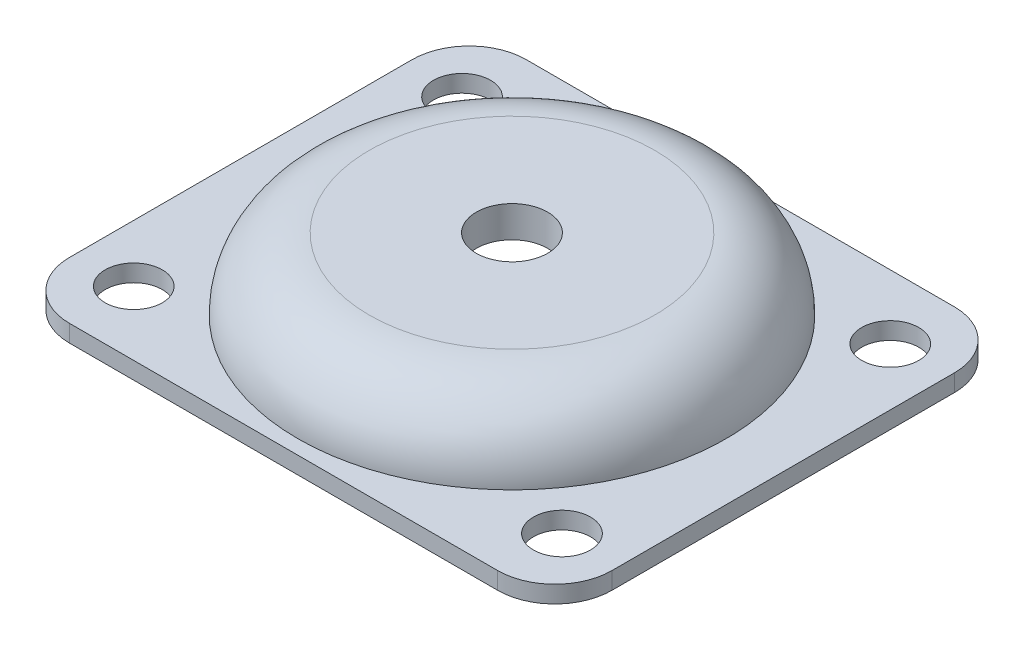
ISO-10303-21;
HEADER;
FILE_DESCRIPTION(('STEP AP214'),'2;1');
FILE_NAME('part.step','',(''),(''),'','','');
FILE_SCHEMA(('AUTOMOTIVE_DESIGN { 1 0 10303 214 1 1 1 1 }'));
ENDSEC;
DATA;
#1=APPLICATION_CONTEXT('core data for automotive mechanical design processes');
#2=APPLICATION_PROTOCOL_DEFINITION('international standard','automotive_design',2000,#1);
#3=PRODUCT_CONTEXT('',#1,'mechanical');
#4=PRODUCT('Part','Part','',(#3));
#5=PRODUCT_RELATED_PRODUCT_CATEGORY('part','',(#4));
#6=PRODUCT_DEFINITION_FORMATION('','',#4);
#7=PRODUCT_DEFINITION_CONTEXT('part definition',#1,'design');
#8=PRODUCT_DEFINITION('design','',#6,#7);
#9=PRODUCT_DEFINITION_SHAPE('','',#8);
#10=(LENGTH_UNIT() NAMED_UNIT(*) SI_UNIT(.MILLI.,.METRE.));
#11=(NAMED_UNIT(*) PLANE_ANGLE_UNIT() SI_UNIT($,.RADIAN.));
#12=(NAMED_UNIT(*) SI_UNIT($,.STERADIAN.) SOLID_ANGLE_UNIT());
#13=UNCERTAINTY_MEASURE_WITH_UNIT(LENGTH_MEASURE(1.E-05),#10,'distance_accuracy_value','');
#14=(GEOMETRIC_REPRESENTATION_CONTEXT(3) GLOBAL_UNCERTAINTY_ASSIGNED_CONTEXT((#13)) GLOBAL_UNIT_ASSIGNED_CONTEXT((#10,
#11,#12)) REPRESENTATION_CONTEXT('',''));
#15=CARTESIAN_POINT('',(0.,0.,0.));
#16=DIRECTION('',(0.,0.,1.));
#17=DIRECTION('',(1.,0.,0.));
#18=AXIS2_PLACEMENT_3D('',#15,#16,#17);
#19=CARTESIAN_POINT('',(19.,1.2,-16.));
#20=DIRECTION('',(-1.,0.,0.));
#21=DIRECTION('',(0.,0.,1.));
#22=AXIS2_PLACEMENT_3D('',#19,#20,#21);
#23=PLANE('',#22);
#24=DIRECTION('',(0.,0.,-1.));
#25=VECTOR('',#24,1.);
#26=CARTESIAN_POINT('',(19.,0.,-16.));
#27=LINE('',#26,#25);
#28=CARTESIAN_POINT('',(19.,0.,12.));
#29=VERTEX_POINT('',#28);
#30=CARTESIAN_POINT('',(19.,0.,-12.));
#31=VERTEX_POINT('',#30);
#32=EDGE_CURVE('E172',#29,#31,#27,.T.);
#33=ORIENTED_EDGE('',*,*,#32,.T.);
#34=DIRECTION('',(0.,-1.,0.));
#35=VECTOR('',#34,1.);
#36=CARTESIAN_POINT('',(19.,1.2,-12.));
#37=LINE('',#36,#35);
#38=CARTESIAN_POINT('',(19.,1.2,-12.));
#39=VERTEX_POINT('',#38);
#40=EDGE_CURVE('E11',#31,#39,#37,.F.);
#41=ORIENTED_EDGE('',*,*,#40,.T.);
#42=DIRECTION('',(0.,0.,-1.));
#43=VECTOR('',#42,1.);
#44=CARTESIAN_POINT('',(19.,1.2,-16.));
#45=LINE('',#44,#43);
#46=CARTESIAN_POINT('',(19.,1.2,12.));
#47=VERTEX_POINT('',#46);
#48=EDGE_CURVE('E128',#47,#39,#45,.T.);
#49=ORIENTED_EDGE('',*,*,#48,.F.);
#50=DIRECTION('',(0.,-1.,0.));
#51=VECTOR('',#50,1.);
#52=CARTESIAN_POINT('',(19.,1.2,12.));
#53=LINE('',#52,#51);
#54=EDGE_CURVE('E44',#47,#29,#53,.T.);
#55=ORIENTED_EDGE('',*,*,#54,.T.);
#56=EDGE_LOOP('',(#33,#41,#49,#55));
#57=FACE_BOUND('',#56,.T.);
#58=ADVANCED_FACE('F36',(#57),#23,.F.);
#59=CARTESIAN_POINT('',(-19.,1.2,-16.));
#60=DIRECTION('',(0.,0.,1.));
#61=DIRECTION('',(1.,0.,0.));
#62=AXIS2_PLACEMENT_3D('',#59,#60,#61);
#63=PLANE('',#62);
#64=DIRECTION('',(-1.,0.,0.));
#65=VECTOR('',#64,1.);
#66=CARTESIAN_POINT('',(-19.,0.,-16.));
#67=LINE('',#66,#65);
#68=CARTESIAN_POINT('',(15.,0.,-16.));
#69=VERTEX_POINT('',#68);
#70=CARTESIAN_POINT('',(-15.,0.,-16.));
#71=VERTEX_POINT('',#70);
#72=EDGE_CURVE('E133',#69,#71,#67,.T.);
#73=ORIENTED_EDGE('',*,*,#72,.T.);
#74=DIRECTION('',(0.,-1.,0.));
#75=VECTOR('',#74,1.);
#76=CARTESIAN_POINT('',(-15.,1.2,-16.));
#77=LINE('',#76,#75);
#78=CARTESIAN_POINT('',(-15.,1.2,-16.));
#79=VERTEX_POINT('',#78);
#80=EDGE_CURVE('E51',#71,#79,#77,.F.);
#81=ORIENTED_EDGE('',*,*,#80,.T.);
#82=DIRECTION('',(-1.,0.,0.));
#83=VECTOR('',#82,1.);
#84=CARTESIAN_POINT('',(-19.,1.2,-16.));
#85=LINE('',#84,#83);
#86=CARTESIAN_POINT('',(15.,1.2,-16.));
#87=VERTEX_POINT('',#86);
#88=EDGE_CURVE('E131',#87,#79,#85,.T.);
#89=ORIENTED_EDGE('',*,*,#88,.F.);
#90=DIRECTION('',(0.,-1.,0.));
#91=VECTOR('',#90,1.);
#92=CARTESIAN_POINT('',(15.,1.2,-16.));
#93=LINE('',#92,#91);
#94=EDGE_CURVE('E164',#87,#69,#93,.T.);
#95=ORIENTED_EDGE('',*,*,#94,.T.);
#96=EDGE_LOOP('',(#73,#81,#89,#95));
#97=FACE_BOUND('',#96,.T.);
#98=ADVANCED_FACE('F237',(#97),#63,.F.);
#99=CARTESIAN_POINT('',(-19.,1.2,-16.));
#100=DIRECTION('',(1.,0.,0.));
#101=DIRECTION('',(0.,0.,-1.));
#102=AXIS2_PLACEMENT_3D('',#99,#100,#101);
#103=PLANE('',#102);
#104=DIRECTION('',(0.,0.,1.));
#105=VECTOR('',#104,1.);
#106=CARTESIAN_POINT('',(-19.,0.,-16.));
#107=LINE('',#106,#105);
#108=CARTESIAN_POINT('',(-19.,0.,-12.));
#109=VERTEX_POINT('',#108);
#110=CARTESIAN_POINT('',(-19.,0.,12.));
#111=VERTEX_POINT('',#110);
#112=EDGE_CURVE('E129',#109,#111,#107,.T.);
#113=ORIENTED_EDGE('',*,*,#112,.T.);
#114=DIRECTION('',(0.,-1.,0.));
#115=VECTOR('',#114,1.);
#116=CARTESIAN_POINT('',(-19.,1.2,12.));
#117=LINE('',#116,#115);
#118=CARTESIAN_POINT('',(-19.,1.2,12.));
#119=VERTEX_POINT('',#118);
#120=EDGE_CURVE('E107',#111,#119,#117,.F.);
#121=ORIENTED_EDGE('',*,*,#120,.T.);
#122=DIRECTION('',(0.,0.,1.));
#123=VECTOR('',#122,1.);
#124=CARTESIAN_POINT('',(-19.,1.2,-16.));
#125=LINE('',#124,#123);
#126=CARTESIAN_POINT('',(-19.,1.2,-12.));
#127=VERTEX_POINT('',#126);
#128=EDGE_CURVE('E184',#127,#119,#125,.T.);
#129=ORIENTED_EDGE('',*,*,#128,.F.);
#130=DIRECTION('',(0.,-1.,0.));
#131=VECTOR('',#130,1.);
#132=CARTESIAN_POINT('',(-19.,1.2,-12.));
#133=LINE('',#132,#131);
#134=EDGE_CURVE('E112',#127,#109,#133,.T.);
#135=ORIENTED_EDGE('',*,*,#134,.T.);
#136=EDGE_LOOP('',(#113,#121,#129,#135));
#137=FACE_BOUND('',#136,.T.);
#138=ADVANCED_FACE('F241',(#137),#103,.F.);
#139=CARTESIAN_POINT('',(-19.,1.2,16.));
#140=DIRECTION('',(0.,0.,-1.));
#141=DIRECTION('',(-1.,0.,0.));
#142=AXIS2_PLACEMENT_3D('',#139,#140,#141);
#143=PLANE('',#142);
#144=DIRECTION('',(1.,0.,0.));
#145=VECTOR('',#144,1.);
#146=CARTESIAN_POINT('',(-19.,1.2,16.));
#147=LINE('',#146,#145);
#148=CARTESIAN_POINT('',(-15.,1.2,16.));
#149=VERTEX_POINT('',#148);
#150=CARTESIAN_POINT('',(15.,1.2,16.));
#151=VERTEX_POINT('',#150);
#152=EDGE_CURVE('E122',#149,#151,#147,.T.);
#153=ORIENTED_EDGE('',*,*,#152,.F.);
#154=DIRECTION('',(0.,-1.,0.));
#155=VECTOR('',#154,1.);
#156=CARTESIAN_POINT('',(-15.,1.2,16.));
#157=LINE('',#156,#155);
#158=CARTESIAN_POINT('',(-15.,0.,16.));
#159=VERTEX_POINT('',#158);
#160=EDGE_CURVE('E106',#149,#159,#157,.T.);
#161=ORIENTED_EDGE('',*,*,#160,.T.);
#162=DIRECTION('',(1.,0.,0.));
#163=VECTOR('',#162,1.);
#164=CARTESIAN_POINT('',(-19.,0.,16.));
#165=LINE('',#164,#163);
#166=CARTESIAN_POINT('',(15.,0.,16.));
#167=VERTEX_POINT('',#166);
#168=EDGE_CURVE('E119',#159,#167,#165,.T.);
#169=ORIENTED_EDGE('',*,*,#168,.T.);
#170=DIRECTION('',(0.,-1.,0.));
#171=VECTOR('',#170,1.);
#172=CARTESIAN_POINT('',(15.,1.2,16.));
#173=LINE('',#172,#171);
#174=EDGE_CURVE('E124',#167,#151,#173,.F.);
#175=ORIENTED_EDGE('',*,*,#174,.T.);
#176=EDGE_LOOP('',(#153,#161,#169,#175));
#177=FACE_BOUND('',#176,.T.);
#178=ADVANCED_FACE('F118',(#177),#143,.F.);
#179=CARTESIAN_POINT('',(0.,1.2,0.));
#180=DIRECTION('',(0.,1.,0.));
#181=DIRECTION('',(0.,0.,1.));
#182=AXIS2_PLACEMENT_3D('',#179,#180,#181);
#183=PLANE('',#182);
#184=CARTESIAN_POINT('',(-15.,1.2,11.5));
#185=DIRECTION('',(0.,1.,0.));
#186=DIRECTION('',(0.,0.,-1.));
#187=AXIS2_PLACEMENT_3D('',#184,#185,#186);
#188=CIRCLE('',#187,2.);
#189=CARTESIAN_POINT('',(-15.,1.2,9.5));
#190=VERTEX_POINT('',#189);
#191=EDGE_CURVE('E197',#190,#190,#188,.T.);
#192=ORIENTED_EDGE('',*,*,#191,.F.);
#193=EDGE_LOOP('',(#192));
#194=FACE_BOUND('',#193,.T.);
#195=CARTESIAN_POINT('',(15.,1.2,11.5));
#196=DIRECTION('',(0.,1.,0.));
#197=DIRECTION('',(0.,0.,-1.));
#198=AXIS2_PLACEMENT_3D('',#195,#196,#197);
#199=CIRCLE('',#198,2.);
#200=CARTESIAN_POINT('',(15.,1.2,9.5));
#201=VERTEX_POINT('',#200);
#202=EDGE_CURVE('E196',#201,#201,#199,.T.);
#203=ORIENTED_EDGE('',*,*,#202,.F.);
#204=EDGE_LOOP('',(#203));
#205=FACE_BOUND('',#204,.T.);
#206=CARTESIAN_POINT('',(15.,1.2,-11.5));
#207=DIRECTION('',(0.,1.,0.));
#208=DIRECTION('',(0.,0.,1.));
#209=AXIS2_PLACEMENT_3D('',#206,#207,#208);
#210=CIRCLE('',#209,2.);
#211=CARTESIAN_POINT('',(15.,1.2,-9.5));
#212=VERTEX_POINT('',#211);
#213=EDGE_CURVE('E203',#212,#212,#210,.T.);
#214=ORIENTED_EDGE('',*,*,#213,.F.);
#215=EDGE_LOOP('',(#214));
#216=FACE_BOUND('',#215,.T.);
#217=CARTESIAN_POINT('',(-15.,1.2,-11.5));
#218=DIRECTION('',(0.,1.,0.));
#219=DIRECTION('',(0.,0.,1.));
#220=AXIS2_PLACEMENT_3D('',#217,#218,#219);
#221=CIRCLE('',#220,2.);
#222=CARTESIAN_POINT('',(-15.,1.2,-9.5));
#223=VERTEX_POINT('',#222);
#224=EDGE_CURVE('E180',#223,#223,#221,.T.);
#225=ORIENTED_EDGE('',*,*,#224,.F.);
#226=EDGE_LOOP('',(#225));
#227=FACE_BOUND('',#226,.T.);
#228=CARTESIAN_POINT('',(0.,1.2,0.));
#229=DIRECTION('',(0.,1.,0.));
#230=DIRECTION('',(0.,0.,1.));
#231=AXIS2_PLACEMENT_3D('',#228,#229,#230);
#232=CIRCLE('',#231,15.);
#233=CARTESIAN_POINT('',(0.,1.2,15.));
#234=VERTEX_POINT('',#233);
#235=EDGE_CURVE('E141',#234,#234,#232,.T.);
#236=ORIENTED_EDGE('',*,*,#235,.F.);
#237=EDGE_LOOP('',(#236));
#238=FACE_BOUND('',#237,.T.);
#239=ORIENTED_EDGE('',*,*,#128,.T.);
#240=CARTESIAN_POINT('',(-15.,1.2,12.));
#241=DIRECTION('',(0.,1.,0.));
#242=DIRECTION('',(0.,0.,1.));
#243=AXIS2_PLACEMENT_3D('',#240,#241,#242);
#244=CIRCLE('',#243,4.);
#245=EDGE_CURVE('E162',#119,#149,#244,.T.);
#246=ORIENTED_EDGE('',*,*,#245,.T.);
#247=ORIENTED_EDGE('',*,*,#152,.T.);
#248=CARTESIAN_POINT('',(15.,1.2,12.));
#249=DIRECTION('',(0.,1.,0.));
#250=DIRECTION('',(0.,0.,1.));
#251=AXIS2_PLACEMENT_3D('',#248,#249,#250);
#252=CIRCLE('',#251,4.);
#253=EDGE_CURVE('E157',#151,#47,#252,.T.);
#254=ORIENTED_EDGE('',*,*,#253,.T.);
#255=ORIENTED_EDGE('',*,*,#48,.T.);
#256=CARTESIAN_POINT('',(15.,1.2,-12.));
#257=DIRECTION('',(0.,1.,0.));
#258=DIRECTION('',(0.,0.,1.));
#259=AXIS2_PLACEMENT_3D('',#256,#257,#258);
#260=CIRCLE('',#259,4.);
#261=EDGE_CURVE('E58',#39,#87,#260,.T.);
#262=ORIENTED_EDGE('',*,*,#261,.T.);
#263=ORIENTED_EDGE('',*,*,#88,.T.);
#264=CARTESIAN_POINT('',(-15.,1.2,-12.));
#265=DIRECTION('',(0.,1.,0.));
#266=DIRECTION('',(0.,0.,1.));
#267=AXIS2_PLACEMENT_3D('',#264,#265,#266);
#268=CIRCLE('',#267,4.);
#269=EDGE_CURVE('E160',#79,#127,#268,.T.);
#270=ORIENTED_EDGE('',*,*,#269,.T.);
#271=EDGE_LOOP('',(#239,#246,#247,#254,#255,#262,#263,#270));
#272=FACE_BOUND('',#271,.T.);
#273=ADVANCED_FACE('F249',(#194,#205,#216,#227,#238,#272),#183,.T.);
#274=CARTESIAN_POINT('',(0.,0.,0.));
#275=DIRECTION('',(0.,1.,0.));
#276=DIRECTION('',(0.,0.,1.));
#277=AXIS2_PLACEMENT_3D('',#274,#275,#276);
#278=PLANE('',#277);
#279=CARTESIAN_POINT('',(0.,0.,0.));
#280=DIRECTION('',(0.,-1.,0.));
#281=DIRECTION('',(0.,0.,-1.));
#282=AXIS2_PLACEMENT_3D('',#279,#280,#281);
#283=CIRCLE('',#282,14.);
#284=CARTESIAN_POINT('',(0.,0.,-14.));
#285=VERTEX_POINT('',#284);
#286=EDGE_CURVE('E147',#285,#285,#283,.T.);
#287=ORIENTED_EDGE('',*,*,#286,.F.);
#288=EDGE_LOOP('',(#287));
#289=FACE_BOUND('',#288,.T.);
#290=CARTESIAN_POINT('',(-15.,0.,11.5));
#291=DIRECTION('',(0.,1.,0.));
#292=DIRECTION('',(0.,0.,1.));
#293=AXIS2_PLACEMENT_3D('',#290,#291,#292);
#294=CIRCLE('',#293,2.);
#295=CARTESIAN_POINT('',(-15.,0.,13.5));
#296=VERTEX_POINT('',#295);
#297=EDGE_CURVE('E193',#296,#296,#294,.F.);
#298=ORIENTED_EDGE('',*,*,#297,.F.);
#299=EDGE_LOOP('',(#298));
#300=FACE_BOUND('',#299,.T.);
#301=CARTESIAN_POINT('',(15.,0.,11.5));
#302=DIRECTION('',(0.,1.,0.));
#303=DIRECTION('',(0.,0.,1.));
#304=AXIS2_PLACEMENT_3D('',#301,#302,#303);
#305=CIRCLE('',#304,2.);
#306=CARTESIAN_POINT('',(15.,0.,13.5));
#307=VERTEX_POINT('',#306);
#308=EDGE_CURVE('E200',#307,#307,#305,.F.);
#309=ORIENTED_EDGE('',*,*,#308,.F.);
#310=EDGE_LOOP('',(#309));
#311=FACE_BOUND('',#310,.T.);
#312=CARTESIAN_POINT('',(15.,0.,-11.5));
#313=DIRECTION('',(0.,1.,0.));
#314=DIRECTION('',(0.,0.,1.));
#315=AXIS2_PLACEMENT_3D('',#312,#313,#314);
#316=CIRCLE('',#315,2.);
#317=CARTESIAN_POINT('',(15.,0.,-9.5));
#318=VERTEX_POINT('',#317);
#319=EDGE_CURVE('E192',#318,#318,#316,.F.);
#320=ORIENTED_EDGE('',*,*,#319,.F.);
#321=EDGE_LOOP('',(#320));
#322=FACE_BOUND('',#321,.T.);
#323=CARTESIAN_POINT('',(-15.,0.,-11.5));
#324=DIRECTION('',(0.,1.,0.));
#325=DIRECTION('',(0.,0.,1.));
#326=AXIS2_PLACEMENT_3D('',#323,#324,#325);
#327=CIRCLE('',#326,2.);
#328=CARTESIAN_POINT('',(-15.,0.,-9.5));
#329=VERTEX_POINT('',#328);
#330=EDGE_CURVE('E177',#329,#329,#327,.F.);
#331=ORIENTED_EDGE('',*,*,#330,.F.);
#332=EDGE_LOOP('',(#331));
#333=FACE_BOUND('',#332,.T.);
#334=ORIENTED_EDGE('',*,*,#168,.F.);
#335=CARTESIAN_POINT('',(-15.,0.,12.));
#336=DIRECTION('',(0.,1.,0.));
#337=DIRECTION('',(0.,0.,1.));
#338=AXIS2_PLACEMENT_3D('',#335,#336,#337);
#339=CIRCLE('',#338,4.);
#340=EDGE_CURVE('E102',#159,#111,#339,.F.);
#341=ORIENTED_EDGE('',*,*,#340,.T.);
#342=ORIENTED_EDGE('',*,*,#112,.F.);
#343=CARTESIAN_POINT('',(-15.,0.,-12.));
#344=DIRECTION('',(0.,1.,0.));
#345=DIRECTION('',(0.,0.,1.));
#346=AXIS2_PLACEMENT_3D('',#343,#344,#345);
#347=CIRCLE('',#346,4.);
#348=EDGE_CURVE('E113',#109,#71,#347,.F.);
#349=ORIENTED_EDGE('',*,*,#348,.T.);
#350=ORIENTED_EDGE('',*,*,#72,.F.);
#351=CARTESIAN_POINT('',(15.,0.,-12.));
#352=DIRECTION('',(0.,1.,0.));
#353=DIRECTION('',(0.,0.,1.));
#354=AXIS2_PLACEMENT_3D('',#351,#352,#353);
#355=CIRCLE('',#354,4.);
#356=EDGE_CURVE('E151',#69,#31,#355,.F.);
#357=ORIENTED_EDGE('',*,*,#356,.T.);
#358=ORIENTED_EDGE('',*,*,#32,.F.);
#359=CARTESIAN_POINT('',(15.,0.,12.));
#360=DIRECTION('',(0.,1.,0.));
#361=DIRECTION('',(0.,0.,1.));
#362=AXIS2_PLACEMENT_3D('',#359,#360,#361);
#363=CIRCLE('',#362,4.);
#364=EDGE_CURVE('E123',#29,#167,#363,.F.);
#365=ORIENTED_EDGE('',*,*,#364,.T.);
#366=EDGE_LOOP('',(#334,#341,#342,#349,#350,#357,#358,#365));
#367=FACE_BOUND('',#366,.T.);
#368=ADVANCED_FACE('F126',(#289,#300,#311,#322,#333,#367),#278,.F.);
#369=CARTESIAN_POINT('',(0.,6.2,0.));
#370=DIRECTION('',(0.,1.,0.));
#371=DIRECTION('',(0.,0.,1.));
#372=AXIS2_PLACEMENT_3D('',#369,#370,#371);
#373=PLANE('',#372);
#374=CARTESIAN_POINT('',(0.,6.2,0.));
#375=DIRECTION('',(0.,1.,0.));
#376=DIRECTION('',(0.,0.,1.));
#377=AXIS2_PLACEMENT_3D('',#374,#375,#376);
#378=CIRCLE('',#377,2.5);
#379=CARTESIAN_POINT('',(0.,6.2,2.5));
#380=VERTEX_POINT('',#379);
#381=EDGE_CURVE('E148',#380,#380,#378,.T.);
#382=ORIENTED_EDGE('',*,*,#381,.F.);
#383=EDGE_LOOP('',(#382));
#384=FACE_BOUND('',#383,.T.);
#385=CARTESIAN_POINT('',(0.,6.2,0.));
#386=DIRECTION('',(0.,1.,0.));
#387=DIRECTION('',(0.,0.,1.));
#388=AXIS2_PLACEMENT_3D('',#385,#386,#387);
#389=CIRCLE('',#388,10.);
#390=CARTESIAN_POINT('',(0.,6.2,10.));
#391=VERTEX_POINT('',#390);
#392=EDGE_CURVE('E137',#391,#391,#389,.T.);
#393=ORIENTED_EDGE('',*,*,#392,.T.);
#394=EDGE_LOOP('',(#393));
#395=FACE_BOUND('',#394,.T.);
#396=ADVANCED_FACE('F217',(#384,#395),#373,.T.);
#397=CARTESIAN_POINT('',(0.,1.2,0.));
#398=DIRECTION('',(0.,1.,0.));
#399=DIRECTION('',(0.,0.,1.));
#400=AXIS2_PLACEMENT_3D('',#397,#398,#399);
#401=TOROIDAL_SURFACE('',#400,10.,5.);
#402=ORIENTED_EDGE('',*,*,#235,.T.);
#403=EDGE_LOOP('',(#402));
#404=FACE_BOUND('',#403,.T.);
#405=ORIENTED_EDGE('',*,*,#392,.F.);
#406=EDGE_LOOP('',(#405));
#407=FACE_BOUND('',#406,.T.);
#408=ADVANCED_FACE('F220',(#404,#407),#401,.T.);
#409=CARTESIAN_POINT('',(-15.,-0.000999999999999916,-11.5));
#410=DIRECTION('',(0.,1.,0.));
#411=DIRECTION('',(0.,0.,1.));
#412=AXIS2_PLACEMENT_3D('',#409,#410,#411);
#413=CYLINDRICAL_SURFACE('',#412,2.);
#414=ORIENTED_EDGE('',*,*,#224,.T.);
#415=EDGE_LOOP('',(#414));
#416=FACE_BOUND('',#415,.T.);
#417=ORIENTED_EDGE('',*,*,#330,.T.);
#418=EDGE_LOOP('',(#417));
#419=FACE_BOUND('',#418,.T.);
#420=ADVANCED_FACE('F225',(#416,#419),#413,.F.);
#421=CARTESIAN_POINT('',(15.,-0.000999999999999916,-11.5));
#422=DIRECTION('',(0.,1.,0.));
#423=DIRECTION('',(0.,0.,1.));
#424=AXIS2_PLACEMENT_3D('',#421,#422,#423);
#425=CYLINDRICAL_SURFACE('',#424,2.);
#426=ORIENTED_EDGE('',*,*,#213,.T.);
#427=EDGE_LOOP('',(#426));
#428=FACE_BOUND('',#427,.T.);
#429=ORIENTED_EDGE('',*,*,#319,.T.);
#430=EDGE_LOOP('',(#429));
#431=FACE_BOUND('',#430,.T.);
#432=ADVANCED_FACE('F231',(#428,#431),#425,.F.);
#433=CARTESIAN_POINT('',(15.,-0.000999999999999916,11.5));
#434=DIRECTION('',(0.,1.,0.));
#435=DIRECTION('',(0.,0.,1.));
#436=AXIS2_PLACEMENT_3D('',#433,#434,#435);
#437=CYLINDRICAL_SURFACE('',#436,2.);
#438=ORIENTED_EDGE('',*,*,#202,.T.);
#439=EDGE_LOOP('',(#438));
#440=FACE_BOUND('',#439,.T.);
#441=ORIENTED_EDGE('',*,*,#308,.T.);
#442=EDGE_LOOP('',(#441));
#443=FACE_BOUND('',#442,.T.);
#444=ADVANCED_FACE('F260',(#440,#443),#437,.F.);
#445=CARTESIAN_POINT('',(-15.,-0.000999999999999916,11.5));
#446=DIRECTION('',(0.,1.,0.));
#447=DIRECTION('',(0.,0.,1.));
#448=AXIS2_PLACEMENT_3D('',#445,#446,#447);
#449=CYLINDRICAL_SURFACE('',#448,2.);
#450=ORIENTED_EDGE('',*,*,#191,.T.);
#451=EDGE_LOOP('',(#450));
#452=FACE_BOUND('',#451,.T.);
#453=ORIENTED_EDGE('',*,*,#297,.T.);
#454=EDGE_LOOP('',(#453));
#455=FACE_BOUND('',#454,.T.);
#456=ADVANCED_FACE('F256',(#452,#455),#449,.F.);
#457=CARTESIAN_POINT('',(0.,4.,0.));
#458=DIRECTION('',(0.,-1.,0.));
#459=DIRECTION('',(0.,0.,-1.));
#460=AXIS2_PLACEMENT_3D('',#457,#458,#459);
#461=PLANE('',#460);
#462=CARTESIAN_POINT('',(0.,4.,0.));
#463=DIRECTION('',(0.,-1.,0.));
#464=DIRECTION('',(0.,0.,-1.));
#465=AXIS2_PLACEMENT_3D('',#462,#463,#464);
#466=CIRCLE('',#465,2.5);
#467=CARTESIAN_POINT('',(0.,4.,2.5));
#468=VERTEX_POINT('',#467);
#469=EDGE_CURVE('E144',#468,#468,#466,.T.);
#470=ORIENTED_EDGE('',*,*,#469,.F.);
#471=EDGE_LOOP('',(#470));
#472=FACE_BOUND('',#471,.T.);
#473=CARTESIAN_POINT('',(0.,4.,0.));
#474=DIRECTION('',(0.,-1.,0.));
#475=DIRECTION('',(0.,0.,-1.));
#476=AXIS2_PLACEMENT_3D('',#473,#474,#475);
#477=CIRCLE('',#476,10.);
#478=CARTESIAN_POINT('',(0.,4.,-10.));
#479=VERTEX_POINT('',#478);
#480=EDGE_CURVE('E140',#479,#479,#477,.T.);
#481=ORIENTED_EDGE('',*,*,#480,.T.);
#482=EDGE_LOOP('',(#481));
#483=FACE_BOUND('',#482,.T.);
#484=ADVANCED_FACE('F259',(#472,#483),#461,.T.);
#485=CARTESIAN_POINT('',(0.,0.,0.));
#486=DIRECTION('',(0.,-1.,0.));
#487=DIRECTION('',(0.,0.,-1.));
#488=AXIS2_PLACEMENT_3D('',#485,#486,#487);
#489=TOROIDAL_SURFACE('',#488,10.,4.);
#490=ORIENTED_EDGE('',*,*,#286,.T.);
#491=EDGE_LOOP('',(#490));
#492=FACE_BOUND('',#491,.T.);
#493=ORIENTED_EDGE('',*,*,#480,.F.);
#494=EDGE_LOOP('',(#493));
#495=FACE_BOUND('',#494,.T.);
#496=ADVANCED_FACE('F270',(#492,#495),#489,.F.);
#497=CARTESIAN_POINT('',(0.,0.,0.));
#498=DIRECTION('',(0.,1.,0.));
#499=DIRECTION('',(0.,0.,1.));
#500=AXIS2_PLACEMENT_3D('',#497,#498,#499);
#501=CYLINDRICAL_SURFACE('',#500,2.5);
#502=CARTESIAN_POINT('',(0.,4.,2.5));
#503=CARTESIAN_POINT('',(0.,4.02291666666667,2.5));
#504=CARTESIAN_POINT('',(0.,4.04583333333333,2.5));
#505=CARTESIAN_POINT('',(0.,4.09166666666667,2.5));
#506=CARTESIAN_POINT('',(0.,4.11458333333333,2.5));
#507=CARTESIAN_POINT('',(0.,4.16041666666667,2.5));
#508=CARTESIAN_POINT('',(0.,4.18333333333333,2.5));
#509=CARTESIAN_POINT('',(0.,4.22916666666667,2.5));
#510=CARTESIAN_POINT('',(0.,4.25208333333333,2.5));
#511=CARTESIAN_POINT('',(0.,4.29791666666667,2.5));
#512=CARTESIAN_POINT('',(0.,4.32083333333333,2.5));
#513=CARTESIAN_POINT('',(0.,4.36666666666667,2.5));
#514=CARTESIAN_POINT('',(0.,4.38958333333333,2.5));
#515=CARTESIAN_POINT('',(0.,4.43541666666667,2.5));
#516=CARTESIAN_POINT('',(0.,4.45833333333333,2.5));
#517=CARTESIAN_POINT('',(0.,4.50416666666667,2.5));
#518=CARTESIAN_POINT('',(0.,4.52708333333333,2.5));
#519=CARTESIAN_POINT('',(0.,4.57291666666667,2.5));
#520=CARTESIAN_POINT('',(0.,4.59583333333333,2.5));
#521=CARTESIAN_POINT('',(0.,4.64166666666667,2.5));
#522=CARTESIAN_POINT('',(0.,4.66458333333333,2.5));
#523=CARTESIAN_POINT('',(0.,4.71041666666667,2.5));
#524=CARTESIAN_POINT('',(0.,4.73333333333333,2.5));
#525=CARTESIAN_POINT('',(0.,4.77916666666667,2.5));
#526=CARTESIAN_POINT('',(0.,4.80208333333333,2.5));
#527=CARTESIAN_POINT('',(0.,4.84791666666667,2.5));
#528=CARTESIAN_POINT('',(0.,4.87083333333333,2.5));
#529=CARTESIAN_POINT('',(0.,4.91666666666667,2.5));
#530=CARTESIAN_POINT('',(0.,4.93958333333333,2.5));
#531=CARTESIAN_POINT('',(0.,4.98541666666667,2.5));
#532=CARTESIAN_POINT('',(0.,5.00833333333333,2.5));
#533=CARTESIAN_POINT('',(0.,5.05416666666667,2.5));
#534=CARTESIAN_POINT('',(0.,5.07708333333333,2.5));
#535=CARTESIAN_POINT('',(0.,5.12291666666667,2.5));
#536=CARTESIAN_POINT('',(0.,5.14583333333333,2.5));
#537=CARTESIAN_POINT('',(0.,5.19166666666667,2.5));
#538=CARTESIAN_POINT('',(0.,5.21458333333333,2.5));
#539=CARTESIAN_POINT('',(0.,5.26041666666667,2.5));
#540=CARTESIAN_POINT('',(0.,5.28333333333333,2.5));
#541=CARTESIAN_POINT('',(0.,5.32916666666667,2.5));
#542=CARTESIAN_POINT('',(0.,5.35208333333333,2.5));
#543=CARTESIAN_POINT('',(0.,5.39791666666667,2.5));
#544=CARTESIAN_POINT('',(0.,5.42083333333333,2.5));
#545=CARTESIAN_POINT('',(0.,5.46666666666667,2.5));
#546=CARTESIAN_POINT('',(0.,5.48958333333333,2.5));
#547=CARTESIAN_POINT('',(0.,5.53541666666667,2.5));
#548=CARTESIAN_POINT('',(0.,5.55833333333333,2.5));
#549=CARTESIAN_POINT('',(0.,5.60416666666667,2.5));
#550=CARTESIAN_POINT('',(0.,5.62708333333333,2.5));
#551=CARTESIAN_POINT('',(0.,5.67291666666667,2.5));
#552=CARTESIAN_POINT('',(0.,5.69583333333333,2.5));
#553=CARTESIAN_POINT('',(0.,5.74166666666667,2.5));
#554=CARTESIAN_POINT('',(0.,5.76458333333333,2.5));
#555=CARTESIAN_POINT('',(0.,5.81041666666667,2.5));
#556=CARTESIAN_POINT('',(0.,5.83333333333333,2.5));
#557=CARTESIAN_POINT('',(0.,5.87916666666667,2.5));
#558=CARTESIAN_POINT('',(0.,5.90208333333333,2.5));
#559=CARTESIAN_POINT('',(0.,5.94791666666667,2.5));
#560=CARTESIAN_POINT('',(0.,5.97083333333333,2.5));
#561=CARTESIAN_POINT('',(0.,6.01666666666667,2.5));
#562=CARTESIAN_POINT('',(0.,6.03958333333333,2.5));
#563=CARTESIAN_POINT('',(0.,6.08541666666667,2.5));
#564=CARTESIAN_POINT('',(0.,6.10833333333333,2.5));
#565=CARTESIAN_POINT('',(0.,6.15416666666667,2.5));
#566=CARTESIAN_POINT('',(0.,6.17708333333333,2.5));
#567=CARTESIAN_POINT('',(0.,6.2,2.5));
#568=B_SPLINE_CURVE_WITH_KNOTS('',3,(#502,#503,#504,#505,#506,#507,#508,#509,#510,#511,#512,
#513,#514,#515,#516,#517,#518,#519,#520,#521,#522,#523,#524,#525,#526,#527,#528,#529,#530,#531,
#532,#533,#534,#535,#536,#537,#538,#539,#540,#541,#542,#543,#544,#545,#546,#547,#548,#549,#550,
#551,#552,#553,#554,#555,#556,#557,#558,#559,#560,#561,#562,#563,#564,#565,#566,#567),
.UNSPECIFIED.,.F.,.F.,(4,2,2,2,2,2,2,2,2,2,2,2,2,2,2,2,2,2,2,2,2,2,2,2,2,2,2,2,2,2,2,2,4),(0.,
0.0687500000000002,0.1375,0.20625,0.275,0.343749999999999,0.4125,0.48125,0.55,0.618749999999999,
0.6875,0.75625,0.824999999999999,0.89375,0.9625,1.03125,1.1,1.16875,1.2375,1.30625,1.375,
1.44375,1.5125,1.58125,1.65,1.71875,1.7875,1.85625,1.925,1.99375,2.0625,2.13125,2.2),.UNSPECIFIED.);
#569=EDGE_CURVE('BSEAM215',#468,#380,#568,.T.);
#570=ORIENTED_EDGE('',*,*,#469,.T.);
#571=ORIENTED_EDGE('',*,*,#381,.T.);
#572=ORIENTED_EDGE('',*,*,#569,.T.);
#573=ORIENTED_EDGE('',*,*,#569,.F.);
#574=EDGE_LOOP('',(#570,#572,#571,#573));
#575=FACE_BOUND('',#574,.T.);
#576=ADVANCED_FACE('F215',(#575),#501,.F.);
#577=CARTESIAN_POINT('',(-15.,1.2,12.));
#578=DIRECTION('',(0.,-1.,0.));
#579=DIRECTION('',(0.,0.,-1.));
#580=AXIS2_PLACEMENT_3D('',#577,#578,#579);
#581=CYLINDRICAL_SURFACE('',#580,4.);
#582=ORIENTED_EDGE('',*,*,#245,.F.);
#583=ORIENTED_EDGE('',*,*,#120,.F.);
#584=ORIENTED_EDGE('',*,*,#340,.F.);
#585=ORIENTED_EDGE('',*,*,#160,.F.);
#586=EDGE_LOOP('',(#582,#583,#584,#585));
#587=FACE_BOUND('',#586,.T.);
#588=ADVANCED_FACE('F105',(#587),#581,.T.);
#589=CARTESIAN_POINT('',(-15.,1.2,-12.));
#590=DIRECTION('',(0.,-1.,0.));
#591=DIRECTION('',(0.,0.,-1.));
#592=AXIS2_PLACEMENT_3D('',#589,#590,#591);
#593=CYLINDRICAL_SURFACE('',#592,4.);
#594=ORIENTED_EDGE('',*,*,#269,.F.);
#595=ORIENTED_EDGE('',*,*,#80,.F.);
#596=ORIENTED_EDGE('',*,*,#348,.F.);
#597=ORIENTED_EDGE('',*,*,#134,.F.);
#598=EDGE_LOOP('',(#594,#595,#596,#597));
#599=FACE_BOUND('',#598,.T.);
#600=ADVANCED_FACE('F278',(#599),#593,.T.);
#601=CARTESIAN_POINT('',(15.,1.2,-12.));
#602=DIRECTION('',(0.,-1.,0.));
#603=DIRECTION('',(0.,0.,-1.));
#604=AXIS2_PLACEMENT_3D('',#601,#602,#603);
#605=CYLINDRICAL_SURFACE('',#604,4.);
#606=ORIENTED_EDGE('',*,*,#261,.F.);
#607=ORIENTED_EDGE('',*,*,#40,.F.);
#608=ORIENTED_EDGE('',*,*,#356,.F.);
#609=ORIENTED_EDGE('',*,*,#94,.F.);
#610=EDGE_LOOP('',(#606,#607,#608,#609));
#611=FACE_BOUND('',#610,.T.);
#612=ADVANCED_FACE('F289',(#611),#605,.T.);
#613=CARTESIAN_POINT('',(15.,1.2,12.));
#614=DIRECTION('',(0.,-1.,0.));
#615=DIRECTION('',(0.,0.,-1.));
#616=AXIS2_PLACEMENT_3D('',#613,#614,#615);
#617=CYLINDRICAL_SURFACE('',#616,4.);
#618=ORIENTED_EDGE('',*,*,#253,.F.);
#619=ORIENTED_EDGE('',*,*,#174,.F.);
#620=ORIENTED_EDGE('',*,*,#364,.F.);
#621=ORIENTED_EDGE('',*,*,#54,.F.);
#622=EDGE_LOOP('',(#618,#619,#620,#621));
#623=FACE_BOUND('',#622,.T.);
#624=ADVANCED_FACE('F38',(#623),#617,.T.);
#625=CLOSED_SHELL('',(#58,#98,#138,#178,#273,#368,#396,#408,#420,#432,#444,#456,#484,#496,#576,
#588,#600,#612,#624));
#626=MANIFOLD_SOLID_BREP('B2',#625);
#627=ADVANCED_BREP_SHAPE_REPRESENTATION('',(#18,#626),#14);
#628=SHAPE_DEFINITION_REPRESENTATION(#9,#627);
ENDSEC;
END-ISO-10303-21;
